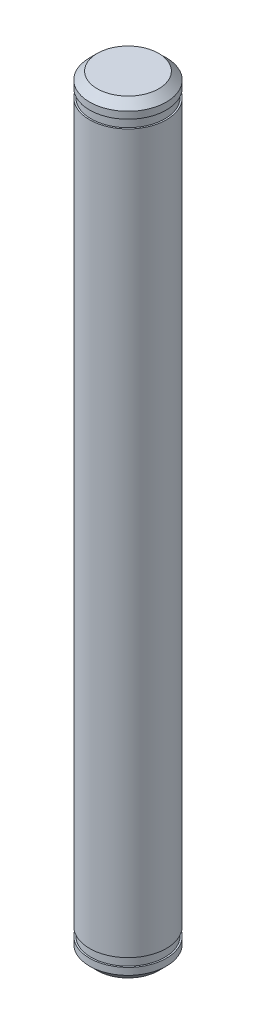
ISO-10303-21;
HEADER;
FILE_DESCRIPTION(('STEP AP214'),'2;1');
FILE_NAME('part.step','',(''),(''),'','','');
FILE_SCHEMA(('AUTOMOTIVE_DESIGN { 1 0 10303 214 1 1 1 1 }'));
ENDSEC;
DATA;
#1=APPLICATION_CONTEXT('core data for automotive mechanical design processes');
#2=APPLICATION_PROTOCOL_DEFINITION('international standard','automotive_design',2000,#1);
#3=PRODUCT_CONTEXT('',#1,'mechanical');
#4=PRODUCT('Part','Part','',(#3));
#5=PRODUCT_RELATED_PRODUCT_CATEGORY('part','',(#4));
#6=PRODUCT_DEFINITION_FORMATION('','',#4);
#7=PRODUCT_DEFINITION_CONTEXT('part definition',#1,'design');
#8=PRODUCT_DEFINITION('design','',#6,#7);
#9=PRODUCT_DEFINITION_SHAPE('','',#8);
#10=(LENGTH_UNIT() NAMED_UNIT(*) SI_UNIT(.MILLI.,.METRE.));
#11=(NAMED_UNIT(*) PLANE_ANGLE_UNIT() SI_UNIT($,.RADIAN.));
#12=(NAMED_UNIT(*) SI_UNIT($,.STERADIAN.) SOLID_ANGLE_UNIT());
#13=UNCERTAINTY_MEASURE_WITH_UNIT(LENGTH_MEASURE(1.E-05),#10,'distance_accuracy_value','');
#14=(GEOMETRIC_REPRESENTATION_CONTEXT(3) GLOBAL_UNCERTAINTY_ASSIGNED_CONTEXT((#13)) GLOBAL_UNIT_ASSIGNED_CONTEXT((#10,
#11,#12)) REPRESENTATION_CONTEXT('',''));
#15=CARTESIAN_POINT('',(0.,0.,0.));
#16=DIRECTION('',(0.,0.,1.));
#17=DIRECTION('',(1.,0.,0.));
#18=AXIS2_PLACEMENT_3D('',#15,#16,#17);
#19=CARTESIAN_POINT('',(0.,40.,0.));
#20=DIRECTION('',(0.,1.,0.));
#21=DIRECTION('',(-1.,0.,0.));
#22=AXIS2_PLACEMENT_3D('',#19,#20,#21);
#23=CYLINDRICAL_SURFACE('',#22,5.);
#24=CARTESIAN_POINT('',(0.,37.,0.));
#25=DIRECTION('',(0.,1.,0.));
#26=DIRECTION('',(-1.,0.,0.));
#27=AXIS2_PLACEMENT_3D('',#24,#25,#26);
#28=CIRCLE('',#27,5.00000000000001);
#29=CARTESIAN_POINT('',(-5.00000000000002,37.,0.));
#30=VERTEX_POINT('',#29);
#31=EDGE_CURVE('E57',#30,#30,#28,.T.);
#32=ORIENTED_EDGE('',*,*,#31,.F.);
#33=EDGE_LOOP('',(#32));
#34=FACE_BOUND('',#33,.T.);
#35=CARTESIAN_POINT('',(0.,-56.5,0.));
#36=DIRECTION('',(0.,1.,0.));
#37=DIRECTION('',(-1.,0.,0.));
#38=AXIS2_PLACEMENT_3D('',#35,#36,#37);
#39=CIRCLE('',#38,5.00000000000001);
#40=CARTESIAN_POINT('',(-4.99999999999999,-56.5,0.));
#41=VERTEX_POINT('',#40);
#42=EDGE_CURVE('E69',#41,#41,#39,.T.);
#43=ORIENTED_EDGE('',*,*,#42,.T.);
#44=EDGE_LOOP('',(#43));
#45=FACE_BOUND('',#44,.T.);
#46=ADVANCED_FACE('F35',(#34,#45),#23,.T.);
#47=CARTESIAN_POINT('',(0.,40.,0.));
#48=DIRECTION('',(0.,-1.,0.));
#49=DIRECTION('',(1.,0.,0.));
#50=AXIS2_PLACEMENT_3D('',#47,#48,#49);
#51=PLANE('',#50);
#52=CARTESIAN_POINT('',(0.,40.,0.));
#53=DIRECTION('',(0.,-1.,0.));
#54=DIRECTION('',(1.,0.,0.));
#55=AXIS2_PLACEMENT_3D('',#52,#53,#54);
#56=CIRCLE('',#55,3.99999999999999);
#57=CARTESIAN_POINT('',(3.99999999999998,40.,0.));
#58=VERTEX_POINT('',#57);
#59=EDGE_CURVE('E10',#58,#58,#56,.F.);
#60=ORIENTED_EDGE('',*,*,#59,.T.);
#61=EDGE_LOOP('',(#60));
#62=FACE_BOUND('',#61,.T.);
#63=ADVANCED_FACE('F110',(#62),#51,.F.);
#64=CARTESIAN_POINT('',(0.,38.1,0.));
#65=DIRECTION('',(0.,1.,0.));
#66=DIRECTION('',(-1.,0.,0.));
#67=AXIS2_PLACEMENT_3D('',#64,#65,#66);
#68=CIRCLE('',#67,5.00000000000001);
#69=CARTESIAN_POINT('',(-5.00000000000002,38.1,0.));
#70=VERTEX_POINT('',#69);
#71=EDGE_CURVE('E56',#70,#70,#68,.T.);
#72=ORIENTED_EDGE('',*,*,#71,.T.);
#73=EDGE_LOOP('',(#72));
#74=FACE_BOUND('',#73,.T.);
#75=CARTESIAN_POINT('',(0.,39.,0.));
#76=DIRECTION('',(0.,-1.,0.));
#77=DIRECTION('',(1.,0.,0.));
#78=AXIS2_PLACEMENT_3D('',#75,#76,#77);
#79=CIRCLE('',#78,5.);
#80=CARTESIAN_POINT('',(4.99999999999999,39.,0.));
#81=VERTEX_POINT('',#80);
#82=EDGE_CURVE('E51',#81,#81,#79,.T.);
#83=ORIENTED_EDGE('',*,*,#82,.T.);
#84=EDGE_LOOP('',(#83));
#85=FACE_BOUND('',#84,.T.);
#86=ADVANCED_FACE('F97',(#74,#85),#23,.T.);
#87=CARTESIAN_POINT('',(0.,40.,0.));
#88=DIRECTION('',(0.,-1.,0.));
#89=DIRECTION('',(1.,0.,0.));
#90=AXIS2_PLACEMENT_3D('',#87,#88,#89);
#91=CONICAL_SURFACE('',#90,3.99999999999999,0.785398163397447);
#92=ORIENTED_EDGE('',*,*,#82,.F.);
#93=EDGE_LOOP('',(#92));
#94=FACE_BOUND('',#93,.T.);
#95=ORIENTED_EDGE('',*,*,#59,.F.);
#96=EDGE_LOOP('',(#95));
#97=FACE_BOUND('',#96,.T.);
#98=ADVANCED_FACE('F38',(#94,#97),#91,.T.);
#99=CARTESIAN_POINT('',(0.,38.1,0.));
#100=DIRECTION('',(0.,1.,0.));
#101=DIRECTION('',(-1.,0.,0.));
#102=AXIS2_PLACEMENT_3D('',#99,#100,#101);
#103=PLANE('',#102);
#104=ORIENTED_EDGE('',*,*,#71,.F.);
#105=EDGE_LOOP('',(#104));
#106=FACE_BOUND('',#105,.T.);
#107=CARTESIAN_POINT('',(0.,38.1,0.));
#108=DIRECTION('',(0.,1.,0.));
#109=DIRECTION('',(-1.,0.,0.));
#110=AXIS2_PLACEMENT_3D('',#107,#108,#109);
#111=CIRCLE('',#110,4.8);
#112=CARTESIAN_POINT('',(-4.80000000000001,38.1,0.));
#113=VERTEX_POINT('',#112);
#114=EDGE_CURVE('E60',#113,#113,#111,.T.);
#115=ORIENTED_EDGE('',*,*,#114,.T.);
#116=EDGE_LOOP('',(#115));
#117=FACE_BOUND('',#116,.T.);
#118=ADVANCED_FACE('F122',(#106,#117),#103,.F.);
#119=CARTESIAN_POINT('',(0.,37.,0.));
#120=DIRECTION('',(0.,1.,0.));
#121=DIRECTION('',(-1.,0.,0.));
#122=AXIS2_PLACEMENT_3D('',#119,#120,#121);
#123=PLANE('',#122);
#124=ORIENTED_EDGE('',*,*,#31,.T.);
#125=EDGE_LOOP('',(#124));
#126=FACE_BOUND('',#125,.T.);
#127=CARTESIAN_POINT('',(0.,37.,0.));
#128=DIRECTION('',(0.,1.,0.));
#129=DIRECTION('',(-1.,0.,0.));
#130=AXIS2_PLACEMENT_3D('',#127,#128,#129);
#131=CIRCLE('',#130,4.8);
#132=CARTESIAN_POINT('',(-4.80000000000001,37.,0.));
#133=VERTEX_POINT('',#132);
#134=EDGE_CURVE('E63',#133,#133,#131,.T.);
#135=ORIENTED_EDGE('',*,*,#134,.F.);
#136=EDGE_LOOP('',(#135));
#137=FACE_BOUND('',#136,.T.);
#138=ADVANCED_FACE('F131',(#126,#137),#123,.T.);
#139=CARTESIAN_POINT('',(0.,38.1,0.));
#140=DIRECTION('',(0.,-1.,0.));
#141=DIRECTION('',(1.,0.,0.));
#142=AXIS2_PLACEMENT_3D('',#139,#140,#141);
#143=CYLINDRICAL_SURFACE('',#142,4.8);
#144=ORIENTED_EDGE('',*,*,#114,.F.);
#145=EDGE_LOOP('',(#144));
#146=FACE_BOUND('',#145,.T.);
#147=ORIENTED_EDGE('',*,*,#134,.T.);
#148=EDGE_LOOP('',(#147));
#149=FACE_BOUND('',#148,.T.);
#150=ADVANCED_FACE('F88',(#146,#149),#143,.T.);
#151=CARTESIAN_POINT('',(0.,-57.6,0.));
#152=DIRECTION('',(0.,-1.,0.));
#153=DIRECTION('',(-1.,0.,0.));
#154=AXIS2_PLACEMENT_3D('',#151,#152,#153);
#155=PLANE('',#154);
#156=CARTESIAN_POINT('',(0.,-57.6,0.));
#157=DIRECTION('',(0.,1.,0.));
#158=DIRECTION('',(-1.,0.,0.));
#159=AXIS2_PLACEMENT_3D('',#156,#157,#158);
#160=CIRCLE('',#159,4.8);
#161=CARTESIAN_POINT('',(-4.79999999999999,-57.6,0.));
#162=VERTEX_POINT('',#161);
#163=EDGE_CURVE('E72',#162,#162,#160,.T.);
#164=ORIENTED_EDGE('',*,*,#163,.F.);
#165=EDGE_LOOP('',(#164));
#166=FACE_BOUND('',#165,.T.);
#167=CARTESIAN_POINT('',(0.,-57.6,0.));
#168=DIRECTION('',(0.,1.,0.));
#169=DIRECTION('',(-1.,0.,0.));
#170=AXIS2_PLACEMENT_3D('',#167,#168,#169);
#171=CIRCLE('',#170,5.00000000000001);
#172=CARTESIAN_POINT('',(-4.99999999999999,-57.6,0.));
#173=VERTEX_POINT('',#172);
#174=EDGE_CURVE('E66',#173,#173,#171,.T.);
#175=ORIENTED_EDGE('',*,*,#174,.T.);
#176=EDGE_LOOP('',(#175));
#177=FACE_BOUND('',#176,.T.);
#178=ADVANCED_FACE('F84',(#166,#177),#155,.F.);
#179=CARTESIAN_POINT('',(0.,-56.5,0.));
#180=DIRECTION('',(0.,-1.,0.));
#181=DIRECTION('',(-1.,0.,0.));
#182=AXIS2_PLACEMENT_3D('',#179,#180,#181);
#183=PLANE('',#182);
#184=CARTESIAN_POINT('',(0.,-56.5,0.));
#185=DIRECTION('',(0.,1.,0.));
#186=DIRECTION('',(-1.,0.,0.));
#187=AXIS2_PLACEMENT_3D('',#184,#185,#186);
#188=CIRCLE('',#187,4.8);
#189=CARTESIAN_POINT('',(-4.79999999999999,-56.5,0.));
#190=VERTEX_POINT('',#189);
#191=EDGE_CURVE('E75',#190,#190,#188,.T.);
#192=ORIENTED_EDGE('',*,*,#191,.T.);
#193=EDGE_LOOP('',(#192));
#194=FACE_BOUND('',#193,.T.);
#195=ORIENTED_EDGE('',*,*,#42,.F.);
#196=EDGE_LOOP('',(#195));
#197=FACE_BOUND('',#196,.T.);
#198=ADVANCED_FACE('F87',(#194,#197),#183,.T.);
#199=CARTESIAN_POINT('',(0.,-57.6,0.));
#200=DIRECTION('',(0.,1.,0.));
#201=DIRECTION('',(-1.,0.,0.));
#202=AXIS2_PLACEMENT_3D('',#199,#200,#201);
#203=CYLINDRICAL_SURFACE('',#202,4.8);
#204=ORIENTED_EDGE('',*,*,#163,.T.);
#205=EDGE_LOOP('',(#204));
#206=FACE_BOUND('',#205,.T.);
#207=ORIENTED_EDGE('',*,*,#191,.F.);
#208=EDGE_LOOP('',(#207));
#209=FACE_BOUND('',#208,.T.);
#210=ADVANCED_FACE('F81',(#206,#209),#203,.T.);
#211=CARTESIAN_POINT('',(5.00000000000001,-59.5,0.));
#212=DIRECTION('',(0.,1.,0.));
#213=DIRECTION('',(-1.,0.,0.));
#214=AXIS2_PLACEMENT_3D('',#211,#212,#213);
#215=PLANE('',#214);
#216=CARTESIAN_POINT('',(0.,-59.5,0.));
#217=DIRECTION('',(0.,1.,0.));
#218=DIRECTION('',(-1.,0.,0.));
#219=AXIS2_PLACEMENT_3D('',#216,#217,#218);
#220=CIRCLE('',#219,4.00000000000003);
#221=CARTESIAN_POINT('',(-4.00000000000002,-59.5,0.));
#222=VERTEX_POINT('',#221);
#223=EDGE_CURVE('E43',#222,#222,#220,.F.);
#224=ORIENTED_EDGE('',*,*,#223,.T.);
#225=EDGE_LOOP('',(#224));
#226=FACE_BOUND('',#225,.T.);
#227=ADVANCED_FACE('F101',(#226),#215,.F.);
#228=CARTESIAN_POINT('',(0.,-58.5,0.));
#229=DIRECTION('',(0.,1.,0.));
#230=DIRECTION('',(-1.,0.,0.));
#231=AXIS2_PLACEMENT_3D('',#228,#229,#230);
#232=CONICAL_SURFACE('',#231,5.,0.785398163397454);
#233=ORIENTED_EDGE('',*,*,#223,.F.);
#234=EDGE_LOOP('',(#233));
#235=FACE_BOUND('',#234,.T.);
#236=CARTESIAN_POINT('',(0.,-58.5,0.));
#237=DIRECTION('',(0.,1.,0.));
#238=DIRECTION('',(-1.,0.,0.));
#239=AXIS2_PLACEMENT_3D('',#236,#237,#238);
#240=CIRCLE('',#239,5.);
#241=CARTESIAN_POINT('',(-4.99999999999999,-58.5,0.));
#242=VERTEX_POINT('',#241);
#243=EDGE_CURVE('E47',#242,#242,#240,.T.);
#244=ORIENTED_EDGE('',*,*,#243,.F.);
#245=EDGE_LOOP('',(#244));
#246=FACE_BOUND('',#245,.T.);
#247=ADVANCED_FACE('F95',(#235,#246),#232,.T.);
#248=ORIENTED_EDGE('',*,*,#174,.F.);
#249=EDGE_LOOP('',(#248));
#250=FACE_BOUND('',#249,.T.);
#251=ORIENTED_EDGE('',*,*,#243,.T.);
#252=EDGE_LOOP('',(#251));
#253=FACE_BOUND('',#252,.T.);
#254=ADVANCED_FACE('F92',(#250,#253),#23,.T.);
#255=CLOSED_SHELL('',(#46,#63,#86,#98,#118,#138,#150,#178,#198,#210,#227,#247,#254));
#256=MANIFOLD_SOLID_BREP('B2',#255);
#257=ADVANCED_BREP_SHAPE_REPRESENTATION('',(#18,#256),#14);
#258=SHAPE_DEFINITION_REPRESENTATION(#9,#257);
ENDSEC;
END-ISO-10303-21;
